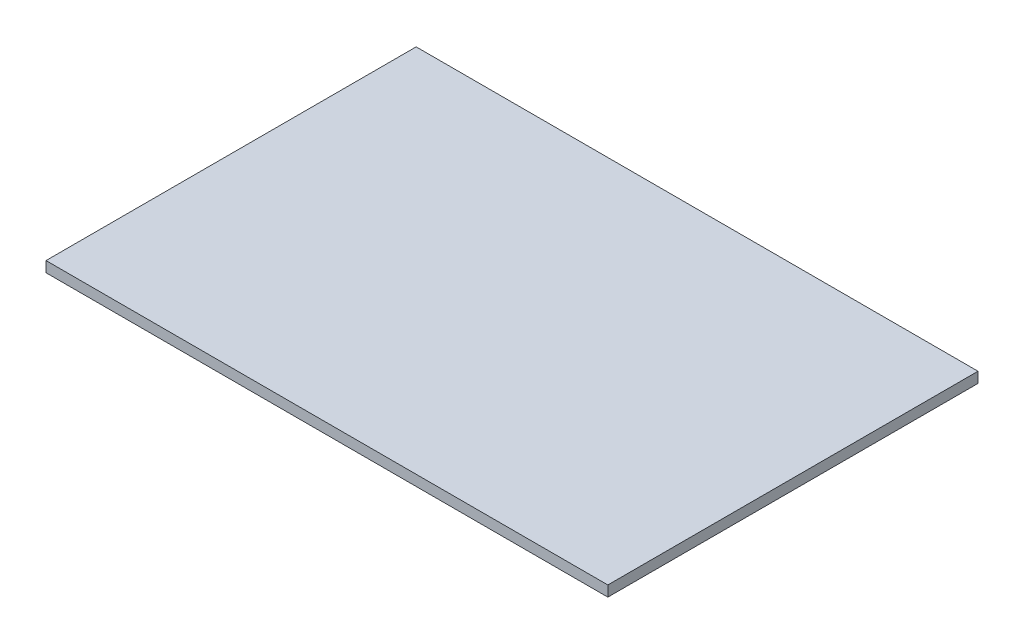
ISO-10303-21;
HEADER;
FILE_DESCRIPTION(('STEP AP214'),'2;1');
FILE_NAME('part.step','',(''),(''),'','','');
FILE_SCHEMA(('AUTOMOTIVE_DESIGN { 1 0 10303 214 1 1 1 1 }'));
ENDSEC;
DATA;
#1=APPLICATION_CONTEXT('core data for automotive mechanical design processes');
#2=APPLICATION_PROTOCOL_DEFINITION('international standard','automotive_design',2000,#1);
#3=PRODUCT_CONTEXT('',#1,'mechanical');
#4=PRODUCT('Part','Part','',(#3));
#5=PRODUCT_RELATED_PRODUCT_CATEGORY('part','',(#4));
#6=PRODUCT_DEFINITION_FORMATION('','',#4);
#7=PRODUCT_DEFINITION_CONTEXT('part definition',#1,'design');
#8=PRODUCT_DEFINITION('design','',#6,#7);
#9=PRODUCT_DEFINITION_SHAPE('','',#8);
#10=(LENGTH_UNIT() NAMED_UNIT(*) SI_UNIT(.MILLI.,.METRE.));
#11=(NAMED_UNIT(*) PLANE_ANGLE_UNIT() SI_UNIT($,.RADIAN.));
#12=(NAMED_UNIT(*) SI_UNIT($,.STERADIAN.) SOLID_ANGLE_UNIT());
#13=UNCERTAINTY_MEASURE_WITH_UNIT(LENGTH_MEASURE(1.E-05),#10,'distance_accuracy_value','');
#14=(GEOMETRIC_REPRESENTATION_CONTEXT(3) GLOBAL_UNCERTAINTY_ASSIGNED_CONTEXT((#13)) GLOBAL_UNIT_ASSIGNED_CONTEXT((#10,
#11,#12)) REPRESENTATION_CONTEXT('',''));
#15=CARTESIAN_POINT('',(0.,0.,0.));
#16=DIRECTION('',(0.,0.,1.));
#17=DIRECTION('',(1.,0.,0.));
#18=AXIS2_PLACEMENT_3D('',#15,#16,#17);
#19=CARTESIAN_POINT('',(85.,1.6,-56.));
#20=DIRECTION('',(-1.,0.,0.));
#21=DIRECTION('',(0.,0.,1.));
#22=AXIS2_PLACEMENT_3D('',#19,#20,#21);
#23=PLANE('',#22);
#24=DIRECTION('',(0.,0.,-1.));
#25=VECTOR('',#24,1.);
#26=CARTESIAN_POINT('',(85.,0.,-56.));
#27=LINE('',#26,#25);
#28=CARTESIAN_POINT('',(85.,0.,0.));
#29=VERTEX_POINT('',#28);
#30=CARTESIAN_POINT('',(85.,0.,-56.));
#31=VERTEX_POINT('',#30);
#32=EDGE_CURVE('E97',#29,#31,#27,.T.);
#33=ORIENTED_EDGE('',*,*,#32,.T.);
#34=DIRECTION('',(0.,-1.,0.));
#35=VECTOR('',#34,1.);
#36=CARTESIAN_POINT('',(85.,1.6,-56.));
#37=LINE('',#36,#35);
#38=CARTESIAN_POINT('',(85.,1.6,-56.));
#39=VERTEX_POINT('',#38);
#40=EDGE_CURVE('E11',#39,#31,#37,.T.);
#41=ORIENTED_EDGE('',*,*,#40,.F.);
#42=DIRECTION('',(0.,0.,-1.));
#43=VECTOR('',#42,1.);
#44=CARTESIAN_POINT('',(85.,1.6,-56.));
#45=LINE('',#44,#43);
#46=CARTESIAN_POINT('',(85.,1.6,0.));
#47=VERTEX_POINT('',#46);
#48=EDGE_CURVE('E85',#47,#39,#45,.T.);
#49=ORIENTED_EDGE('',*,*,#48,.F.);
#50=DIRECTION('',(0.,-1.,0.));
#51=VECTOR('',#50,1.);
#52=CARTESIAN_POINT('',(85.,1.6,0.));
#53=LINE('',#52,#51);
#54=EDGE_CURVE('E93',#47,#29,#53,.T.);
#55=ORIENTED_EDGE('',*,*,#54,.T.);
#56=EDGE_LOOP('',(#33,#41,#49,#55));
#57=FACE_BOUND('',#56,.T.);
#58=ADVANCED_FACE('F34',(#57),#23,.F.);
#59=CARTESIAN_POINT('',(85.,1.6,-56.));
#60=DIRECTION('',(0.,0.,1.));
#61=DIRECTION('',(1.,0.,0.));
#62=AXIS2_PLACEMENT_3D('',#59,#60,#61);
#63=PLANE('',#62);
#64=DIRECTION('',(-1.,0.,0.));
#65=VECTOR('',#64,1.);
#66=CARTESIAN_POINT('',(85.,0.,-56.));
#67=LINE('',#66,#65);
#68=CARTESIAN_POINT('',(0.,0.,-56.));
#69=VERTEX_POINT('',#68);
#70=EDGE_CURVE('E89',#31,#69,#67,.T.);
#71=ORIENTED_EDGE('',*,*,#70,.T.);
#72=DIRECTION('',(0.,-1.,0.));
#73=VECTOR('',#72,1.);
#74=CARTESIAN_POINT('',(0.,1.6,-56.));
#75=LINE('',#74,#73);
#76=CARTESIAN_POINT('',(0.,1.6,-56.));
#77=VERTEX_POINT('',#76);
#78=EDGE_CURVE('E42',#77,#69,#75,.T.);
#79=ORIENTED_EDGE('',*,*,#78,.F.);
#80=DIRECTION('',(-1.,0.,0.));
#81=VECTOR('',#80,1.);
#82=CARTESIAN_POINT('',(85.,1.6,-56.));
#83=LINE('',#82,#81);
#84=EDGE_CURVE('E80',#39,#77,#83,.T.);
#85=ORIENTED_EDGE('',*,*,#84,.F.);
#86=ORIENTED_EDGE('',*,*,#40,.T.);
#87=EDGE_LOOP('',(#71,#79,#85,#86));
#88=FACE_BOUND('',#87,.T.);
#89=ADVANCED_FACE('F88',(#88),#63,.F.);
#90=CARTESIAN_POINT('',(0.,1.6,-56.));
#91=DIRECTION('',(1.,0.,0.));
#92=DIRECTION('',(0.,0.,-1.));
#93=AXIS2_PLACEMENT_3D('',#90,#91,#92);
#94=PLANE('',#93);
#95=DIRECTION('',(0.,0.,1.));
#96=VECTOR('',#95,1.);
#97=CARTESIAN_POINT('',(0.,0.,-56.));
#98=LINE('',#97,#96);
#99=CARTESIAN_POINT('',(0.,0.,0.));
#100=VERTEX_POINT('',#99);
#101=EDGE_CURVE('E67',#69,#100,#98,.T.);
#102=ORIENTED_EDGE('',*,*,#101,.T.);
#103=DIRECTION('',(0.,-1.,0.));
#104=VECTOR('',#103,1.);
#105=CARTESIAN_POINT('',(0.,1.6,0.));
#106=LINE('',#105,#104);
#107=CARTESIAN_POINT('',(0.,1.6,0.));
#108=VERTEX_POINT('',#107);
#109=EDGE_CURVE('E90',#108,#100,#106,.T.);
#110=ORIENTED_EDGE('',*,*,#109,.F.);
#111=DIRECTION('',(0.,0.,1.));
#112=VECTOR('',#111,1.);
#113=CARTESIAN_POINT('',(0.,1.6,-56.));
#114=LINE('',#113,#112);
#115=EDGE_CURVE('E83',#77,#108,#114,.T.);
#116=ORIENTED_EDGE('',*,*,#115,.F.);
#117=ORIENTED_EDGE('',*,*,#78,.T.);
#118=EDGE_LOOP('',(#102,#110,#116,#117));
#119=FACE_BOUND('',#118,.T.);
#120=ADVANCED_FACE('F91',(#119),#94,.F.);
#121=CARTESIAN_POINT('',(85.,1.6,0.));
#122=DIRECTION('',(0.,0.,-1.));
#123=DIRECTION('',(-1.,0.,0.));
#124=AXIS2_PLACEMENT_3D('',#121,#122,#123);
#125=PLANE('',#124);
#126=DIRECTION('',(1.,0.,0.));
#127=VECTOR('',#126,1.);
#128=CARTESIAN_POINT('',(85.,0.,0.));
#129=LINE('',#128,#127);
#130=EDGE_CURVE('E73',#100,#29,#129,.T.);
#131=ORIENTED_EDGE('',*,*,#130,.T.);
#132=ORIENTED_EDGE('',*,*,#54,.F.);
#133=DIRECTION('',(1.,0.,0.));
#134=VECTOR('',#133,1.);
#135=CARTESIAN_POINT('',(85.,1.6,0.));
#136=LINE('',#135,#134);
#137=EDGE_CURVE('E50',#108,#47,#136,.T.);
#138=ORIENTED_EDGE('',*,*,#137,.F.);
#139=ORIENTED_EDGE('',*,*,#109,.T.);
#140=EDGE_LOOP('',(#131,#132,#138,#139));
#141=FACE_BOUND('',#140,.T.);
#142=ADVANCED_FACE('F104',(#141),#125,.F.);
#143=CARTESIAN_POINT('',(85.,1.6,0.));
#144=DIRECTION('',(0.,-1.,0.));
#145=DIRECTION('',(0.,0.,-1.));
#146=AXIS2_PLACEMENT_3D('',#143,#144,#145);
#147=PLANE('',#146);
#148=ORIENTED_EDGE('',*,*,#48,.T.);
#149=ORIENTED_EDGE('',*,*,#84,.T.);
#150=ORIENTED_EDGE('',*,*,#115,.T.);
#151=ORIENTED_EDGE('',*,*,#137,.T.);
#152=EDGE_LOOP('',(#148,#149,#150,#151));
#153=FACE_BOUND('',#152,.T.);
#154=ADVANCED_FACE('F81',(#153),#147,.F.);
#155=CARTESIAN_POINT('',(85.,0.,0.));
#156=DIRECTION('',(0.,-1.,0.));
#157=DIRECTION('',(0.,0.,-1.));
#158=AXIS2_PLACEMENT_3D('',#155,#156,#157);
#159=PLANE('',#158);
#160=ORIENTED_EDGE('',*,*,#32,.F.);
#161=ORIENTED_EDGE('',*,*,#130,.F.);
#162=ORIENTED_EDGE('',*,*,#101,.F.);
#163=ORIENTED_EDGE('',*,*,#70,.F.);
#164=EDGE_LOOP('',(#160,#161,#162,#163));
#165=FACE_BOUND('',#164,.T.);
#166=ADVANCED_FACE('F107',(#165),#159,.T.);
#167=CLOSED_SHELL('',(#58,#89,#120,#142,#154,#166));
#168=MANIFOLD_SOLID_BREP('B2',#167);
#169=ADVANCED_BREP_SHAPE_REPRESENTATION('',(#18,#168),#14);
#170=SHAPE_DEFINITION_REPRESENTATION(#9,#169);
ENDSEC;
END-ISO-10303-21;
